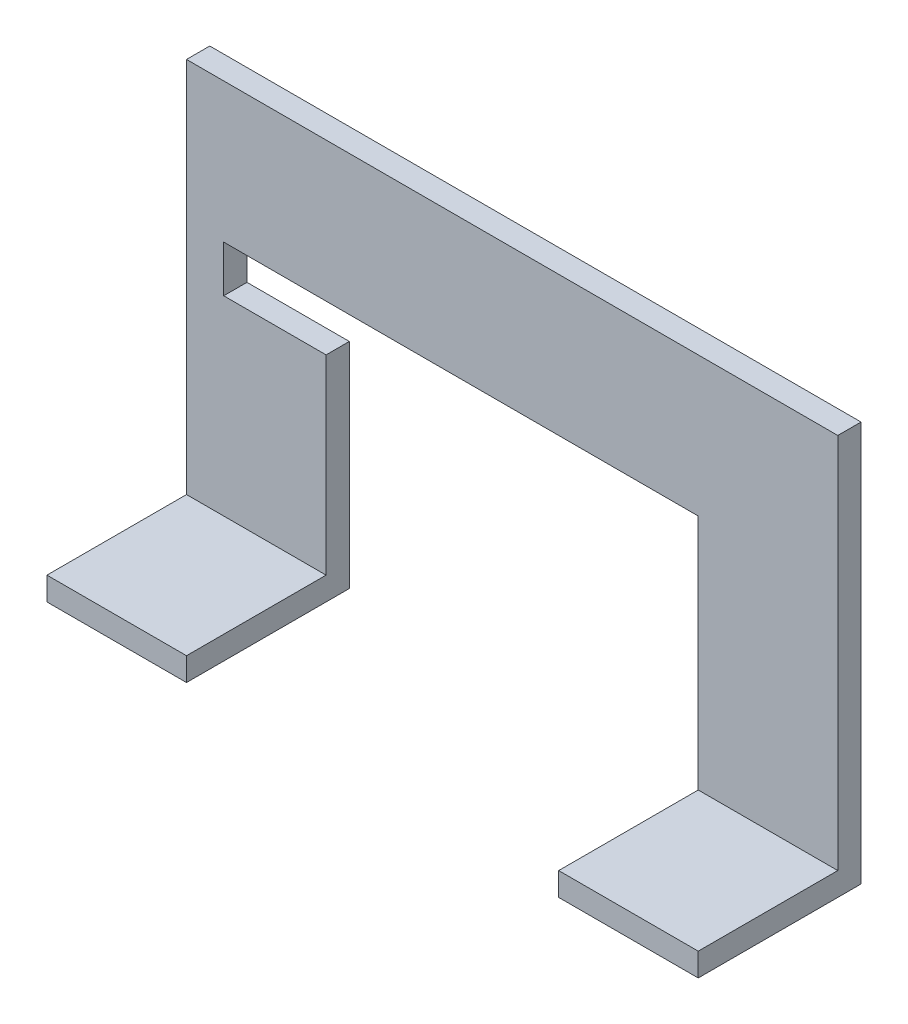
ISO-10303-21;
HEADER;
FILE_DESCRIPTION(('STEP AP214'),'2;1');
FILE_NAME('part.step','',(''),(''),'','','');
FILE_SCHEMA(('AUTOMOTIVE_DESIGN { 1 0 10303 214 1 1 1 1 }'));
ENDSEC;
DATA;
#1=APPLICATION_CONTEXT('core data for automotive mechanical design processes');
#2=APPLICATION_PROTOCOL_DEFINITION('international standard','automotive_design',2000,#1);
#3=PRODUCT_CONTEXT('',#1,'mechanical');
#4=PRODUCT('Part','Part','',(#3));
#5=PRODUCT_RELATED_PRODUCT_CATEGORY('part','',(#4));
#6=PRODUCT_DEFINITION_FORMATION('','',#4);
#7=PRODUCT_DEFINITION_CONTEXT('part definition',#1,'design');
#8=PRODUCT_DEFINITION('design','',#6,#7);
#9=PRODUCT_DEFINITION_SHAPE('','',#8);
#10=(LENGTH_UNIT() NAMED_UNIT(*) SI_UNIT(.MILLI.,.METRE.));
#11=(NAMED_UNIT(*) PLANE_ANGLE_UNIT() SI_UNIT($,.RADIAN.));
#12=(NAMED_UNIT(*) SI_UNIT($,.STERADIAN.) SOLID_ANGLE_UNIT());
#13=UNCERTAINTY_MEASURE_WITH_UNIT(LENGTH_MEASURE(1.E-05),#10,'distance_accuracy_value','');
#14=(GEOMETRIC_REPRESENTATION_CONTEXT(3) GLOBAL_UNCERTAINTY_ASSIGNED_CONTEXT((#13)) GLOBAL_UNIT_ASSIGNED_CONTEXT((#10,
#11,#12)) REPRESENTATION_CONTEXT('',''));
#15=CARTESIAN_POINT('',(0.,0.,0.));
#16=DIRECTION('',(0.,0.,1.));
#17=DIRECTION('',(1.,0.,0.));
#18=AXIS2_PLACEMENT_3D('',#15,#16,#17);
#19=CARTESIAN_POINT('',(20.,-15.,-2.5));
#20=DIRECTION('',(0.,-1.,0.));
#21=DIRECTION('',(0.,0.,-1.));
#22=AXIS2_PLACEMENT_3D('',#19,#20,#21);
#23=PLANE('',#22);
#24=DIRECTION('',(1.,0.,0.));
#25=VECTOR('',#24,1.);
#26=CARTESIAN_POINT('',(20.,-15.,0.));
#27=LINE('',#26,#25);
#28=CARTESIAN_POINT('',(-31.,-15.,0.));
#29=VERTEX_POINT('',#28);
#30=CARTESIAN_POINT('',(20.,-15.,0.));
#31=VERTEX_POINT('',#30);
#32=EDGE_CURVE('E183',#29,#31,#27,.T.);
#33=ORIENTED_EDGE('',*,*,#32,.F.);
#34=DIRECTION('',(0.,0.,1.));
#35=VECTOR('',#34,1.);
#36=CARTESIAN_POINT('',(-31.,-15.,-2.5));
#37=LINE('',#36,#35);
#38=CARTESIAN_POINT('',(-31.,-15.,-2.5));
#39=VERTEX_POINT('',#38);
#40=EDGE_CURVE('E11',#39,#29,#37,.T.);
#41=ORIENTED_EDGE('',*,*,#40,.F.);
#42=DIRECTION('',(1.,0.,0.));
#43=VECTOR('',#42,1.);
#44=CARTESIAN_POINT('',(20.,-15.,-2.5));
#45=LINE('',#44,#43);
#46=CARTESIAN_POINT('',(20.,-15.,-2.5));
#47=VERTEX_POINT('',#46);
#48=EDGE_CURVE('E184',#39,#47,#45,.T.);
#49=ORIENTED_EDGE('',*,*,#48,.T.);
#50=DIRECTION('',(0.,0.,1.));
#51=VECTOR('',#50,1.);
#52=CARTESIAN_POINT('',(20.,-15.,-2.5));
#53=LINE('',#52,#51);
#54=EDGE_CURVE('E38',#47,#31,#53,.T.);
#55=ORIENTED_EDGE('',*,*,#54,.T.);
#56=EDGE_LOOP('',(#33,#41,#49,#55));
#57=FACE_BOUND('',#56,.T.);
#58=ADVANCED_FACE('F35',(#57),#23,.T.);
#59=CARTESIAN_POINT('',(-31.,-15.,-2.5));
#60=DIRECTION('',(1.,0.,0.));
#61=DIRECTION('',(0.,0.,-1.));
#62=AXIS2_PLACEMENT_3D('',#59,#60,#61);
#63=PLANE('',#62);
#64=DIRECTION('',(0.,1.,0.));
#65=VECTOR('',#64,1.);
#66=CARTESIAN_POINT('',(-31.,-15.,0.));
#67=LINE('',#66,#65);
#68=CARTESIAN_POINT('',(-31.,-20.,0.));
#69=VERTEX_POINT('',#68);
#70=EDGE_CURVE('E188',#69,#29,#67,.T.);
#71=ORIENTED_EDGE('',*,*,#70,.F.);
#72=DIRECTION('',(0.,0.,1.));
#73=VECTOR('',#72,1.);
#74=CARTESIAN_POINT('',(-31.,-20.,-2.5));
#75=LINE('',#74,#73);
#76=CARTESIAN_POINT('',(-31.,-20.,-2.5));
#77=VERTEX_POINT('',#76);
#78=EDGE_CURVE('E43',#77,#69,#75,.T.);
#79=ORIENTED_EDGE('',*,*,#78,.F.);
#80=DIRECTION('',(0.,1.,0.));
#81=VECTOR('',#80,1.);
#82=CARTESIAN_POINT('',(-31.,-15.,-2.5));
#83=LINE('',#82,#81);
#84=EDGE_CURVE('E212',#77,#39,#83,.T.);
#85=ORIENTED_EDGE('',*,*,#84,.T.);
#86=ORIENTED_EDGE('',*,*,#40,.T.);
#87=EDGE_LOOP('',(#71,#79,#85,#86));
#88=FACE_BOUND('',#87,.T.);
#89=ADVANCED_FACE('F254',(#88),#63,.T.);
#90=CARTESIAN_POINT('',(-31.,-20.,-2.5));
#91=DIRECTION('',(0.,1.,0.));
#92=DIRECTION('',(-1.,0.,0.));
#93=AXIS2_PLACEMENT_3D('',#90,#91,#92);
#94=PLANE('',#93);
#95=DIRECTION('',(-1.,0.,0.));
#96=VECTOR('',#95,1.);
#97=CARTESIAN_POINT('',(-31.,-20.,0.));
#98=LINE('',#97,#96);
#99=CARTESIAN_POINT('',(-20.,-20.,0.));
#100=VERTEX_POINT('',#99);
#101=EDGE_CURVE('E225',#100,#69,#98,.T.);
#102=ORIENTED_EDGE('',*,*,#101,.F.);
#103=DIRECTION('',(0.,0.,1.));
#104=VECTOR('',#103,1.);
#105=CARTESIAN_POINT('',(-20.,-20.,-2.5));
#106=LINE('',#105,#104);
#107=CARTESIAN_POINT('',(-20.,-20.,-2.5));
#108=VERTEX_POINT('',#107);
#109=EDGE_CURVE('E231',#108,#100,#106,.T.);
#110=ORIENTED_EDGE('',*,*,#109,.F.);
#111=DIRECTION('',(-1.,0.,0.));
#112=VECTOR('',#111,1.);
#113=CARTESIAN_POINT('',(-31.,-20.,-2.5));
#114=LINE('',#113,#112);
#115=EDGE_CURVE('E209',#108,#77,#114,.T.);
#116=ORIENTED_EDGE('',*,*,#115,.T.);
#117=ORIENTED_EDGE('',*,*,#78,.T.);
#118=EDGE_LOOP('',(#102,#110,#116,#117));
#119=FACE_BOUND('',#118,.T.);
#120=ADVANCED_FACE('F285',(#119),#94,.T.);
#121=CARTESIAN_POINT('',(-20.,-20.,-2.5));
#122=DIRECTION('',(1.,0.,0.));
#123=DIRECTION('',(0.,0.,-1.));
#124=AXIS2_PLACEMENT_3D('',#121,#122,#123);
#125=PLANE('',#124);
#126=DIRECTION('',(0.,1.,0.));
#127=VECTOR('',#126,1.);
#128=CARTESIAN_POINT('',(-20.,-20.,0.));
#129=LINE('',#128,#127);
#130=CARTESIAN_POINT('',(-20.,-40.5,0.));
#131=VERTEX_POINT('',#130);
#132=EDGE_CURVE('E223',#131,#100,#129,.T.);
#133=ORIENTED_EDGE('',*,*,#132,.F.);
#134=DIRECTION('',(0.,0.,-1.));
#135=VECTOR('',#134,1.);
#136=CARTESIAN_POINT('',(-20.,-40.5,15.));
#137=LINE('',#136,#135);
#138=CARTESIAN_POINT('',(-20.,-40.5,15.));
#139=VERTEX_POINT('',#138);
#140=EDGE_CURVE('E180',#139,#131,#137,.T.);
#141=ORIENTED_EDGE('',*,*,#140,.F.);
#142=DIRECTION('',(0.,1.,0.));
#143=VECTOR('',#142,1.);
#144=CARTESIAN_POINT('',(-20.,-40.5,15.));
#145=LINE('',#144,#143);
#146=CARTESIAN_POINT('',(-20.,-43.,15.));
#147=VERTEX_POINT('',#146);
#148=EDGE_CURVE('E171',#147,#139,#145,.T.);
#149=ORIENTED_EDGE('',*,*,#148,.F.);
#150=DIRECTION('',(0.,0.,1.));
#151=VECTOR('',#150,1.);
#152=CARTESIAN_POINT('',(-20.,-43.,-2.5));
#153=LINE('',#152,#151);
#154=CARTESIAN_POINT('',(-20.,-43.,-2.5));
#155=VERTEX_POINT('',#154);
#156=EDGE_CURVE('E234',#155,#147,#153,.T.);
#157=ORIENTED_EDGE('',*,*,#156,.F.);
#158=DIRECTION('',(0.,1.,0.));
#159=VECTOR('',#158,1.);
#160=CARTESIAN_POINT('',(-20.,-20.,-2.5));
#161=LINE('',#160,#159);
#162=EDGE_CURVE('E206',#155,#108,#161,.T.);
#163=ORIENTED_EDGE('',*,*,#162,.T.);
#164=ORIENTED_EDGE('',*,*,#109,.T.);
#165=EDGE_LOOP('',(#133,#141,#149,#157,#163,#164));
#166=FACE_BOUND('',#165,.T.);
#167=ADVANCED_FACE('F282',(#166),#125,.T.);
#168=CARTESIAN_POINT('',(-20.,-43.,-2.5));
#169=DIRECTION('',(0.,-1.,0.));
#170=DIRECTION('',(0.,0.,-1.));
#171=AXIS2_PLACEMENT_3D('',#168,#169,#170);
#172=PLANE('',#171);
#173=ORIENTED_EDGE('',*,*,#156,.T.);
#174=DIRECTION('',(1.,0.,0.));
#175=VECTOR('',#174,1.);
#176=CARTESIAN_POINT('',(-35.,-43.,15.));
#177=LINE('',#176,#175);
#178=CARTESIAN_POINT('',(-35.,-43.,15.));
#179=VERTEX_POINT('',#178);
#180=EDGE_CURVE('E168',#179,#147,#177,.T.);
#181=ORIENTED_EDGE('',*,*,#180,.F.);
#182=DIRECTION('',(0.,0.,1.));
#183=VECTOR('',#182,1.);
#184=CARTESIAN_POINT('',(-35.,-43.,-2.5));
#185=LINE('',#184,#183);
#186=CARTESIAN_POINT('',(-35.,-43.,-2.5));
#187=VERTEX_POINT('',#186);
#188=EDGE_CURVE('E236',#187,#179,#185,.T.);
#189=ORIENTED_EDGE('',*,*,#188,.F.);
#190=DIRECTION('',(1.,0.,0.));
#191=VECTOR('',#190,1.);
#192=CARTESIAN_POINT('',(-20.,-43.,-2.5));
#193=LINE('',#192,#191);
#194=EDGE_CURVE('E203',#187,#155,#193,.T.);
#195=ORIENTED_EDGE('',*,*,#194,.T.);
#196=EDGE_LOOP('',(#173,#181,#189,#195));
#197=FACE_BOUND('',#196,.T.);
#198=ADVANCED_FACE('F289',(#197),#172,.T.);
#199=CARTESIAN_POINT('',(-35.,-43.,-2.5));
#200=DIRECTION('',(-1.,0.,0.));
#201=DIRECTION('',(0.,0.,1.));
#202=AXIS2_PLACEMENT_3D('',#199,#200,#201);
#203=PLANE('',#202);
#204=DIRECTION('',(0.,-1.,0.));
#205=VECTOR('',#204,1.);
#206=CARTESIAN_POINT('',(-35.,-43.,0.));
#207=LINE('',#206,#205);
#208=CARTESIAN_POINT('',(-35.,0.,0.));
#209=VERTEX_POINT('',#208);
#210=CARTESIAN_POINT('',(-35.,-40.5,0.));
#211=VERTEX_POINT('',#210);
#212=EDGE_CURVE('E221',#209,#211,#207,.T.);
#213=ORIENTED_EDGE('',*,*,#212,.F.);
#214=DIRECTION('',(0.,0.,1.));
#215=VECTOR('',#214,1.);
#216=CARTESIAN_POINT('',(-35.,0.,-2.5));
#217=LINE('',#216,#215);
#218=CARTESIAN_POINT('',(-35.,0.,-2.5));
#219=VERTEX_POINT('',#218);
#220=EDGE_CURVE('E238',#219,#209,#217,.T.);
#221=ORIENTED_EDGE('',*,*,#220,.F.);
#222=DIRECTION('',(0.,-1.,0.));
#223=VECTOR('',#222,1.);
#224=CARTESIAN_POINT('',(-35.,-43.,-2.5));
#225=LINE('',#224,#223);
#226=EDGE_CURVE('E200',#219,#187,#225,.T.);
#227=ORIENTED_EDGE('',*,*,#226,.T.);
#228=ORIENTED_EDGE('',*,*,#188,.T.);
#229=DIRECTION('',(0.,-1.,0.));
#230=VECTOR('',#229,1.);
#231=CARTESIAN_POINT('',(-35.,-40.5,15.));
#232=LINE('',#231,#230);
#233=CARTESIAN_POINT('',(-35.,-40.5,15.));
#234=VERTEX_POINT('',#233);
#235=EDGE_CURVE('E165',#234,#179,#232,.T.);
#236=ORIENTED_EDGE('',*,*,#235,.F.);
#237=DIRECTION('',(0.,0.,-1.));
#238=VECTOR('',#237,1.);
#239=CARTESIAN_POINT('',(-35.,-40.5,15.));
#240=LINE('',#239,#238);
#241=EDGE_CURVE('E175',#234,#211,#240,.T.);
#242=ORIENTED_EDGE('',*,*,#241,.T.);
#243=EDGE_LOOP('',(#213,#221,#227,#228,#236,#242));
#244=FACE_BOUND('',#243,.T.);
#245=ADVANCED_FACE('F276',(#244),#203,.T.);
#246=CARTESIAN_POINT('',(-35.,0.,-2.5));
#247=DIRECTION('',(0.,1.,0.));
#248=DIRECTION('',(0.,0.,1.));
#249=AXIS2_PLACEMENT_3D('',#246,#247,#248);
#250=PLANE('',#249);
#251=DIRECTION('',(-1.,0.,0.));
#252=VECTOR('',#251,1.);
#253=CARTESIAN_POINT('',(-35.,0.,0.));
#254=LINE('',#253,#252);
#255=CARTESIAN_POINT('',(35.,0.,0.));
#256=VERTEX_POINT('',#255);
#257=EDGE_CURVE('E218',#256,#209,#254,.T.);
#258=ORIENTED_EDGE('',*,*,#257,.F.);
#259=DIRECTION('',(0.,0.,1.));
#260=VECTOR('',#259,1.);
#261=CARTESIAN_POINT('',(35.,0.,-2.5));
#262=LINE('',#261,#260);
#263=CARTESIAN_POINT('',(35.,0.,-2.5));
#264=VERTEX_POINT('',#263);
#265=EDGE_CURVE('E240',#264,#256,#262,.T.);
#266=ORIENTED_EDGE('',*,*,#265,.F.);
#267=DIRECTION('',(-1.,0.,0.));
#268=VECTOR('',#267,1.);
#269=CARTESIAN_POINT('',(-35.,0.,-2.5));
#270=LINE('',#269,#268);
#271=EDGE_CURVE('E197',#264,#219,#270,.T.);
#272=ORIENTED_EDGE('',*,*,#271,.T.);
#273=ORIENTED_EDGE('',*,*,#220,.T.);
#274=EDGE_LOOP('',(#258,#266,#272,#273));
#275=FACE_BOUND('',#274,.T.);
#276=ADVANCED_FACE('F266',(#275),#250,.T.);
#277=CARTESIAN_POINT('',(35.,0.,-2.5));
#278=DIRECTION('',(1.,0.,0.));
#279=DIRECTION('',(0.,1.,0.));
#280=AXIS2_PLACEMENT_3D('',#277,#278,#279);
#281=PLANE('',#280);
#282=DIRECTION('',(0.,1.,0.));
#283=VECTOR('',#282,1.);
#284=CARTESIAN_POINT('',(35.,0.,0.));
#285=LINE('',#284,#283);
#286=CARTESIAN_POINT('',(35.,-40.5,0.));
#287=VERTEX_POINT('',#286);
#288=EDGE_CURVE('E142',#287,#256,#285,.T.);
#289=ORIENTED_EDGE('',*,*,#288,.F.);
#290=DIRECTION('',(0.,0.,-1.));
#291=VECTOR('',#290,1.);
#292=CARTESIAN_POINT('',(35.,-40.5,15.));
#293=LINE('',#292,#291);
#294=CARTESIAN_POINT('',(35.,-40.5,15.));
#295=VERTEX_POINT('',#294);
#296=EDGE_CURVE('E136',#295,#287,#293,.T.);
#297=ORIENTED_EDGE('',*,*,#296,.F.);
#298=DIRECTION('',(0.,-1.,0.));
#299=VECTOR('',#298,1.);
#300=CARTESIAN_POINT('',(35.,-40.5,15.));
#301=LINE('',#300,#299);
#302=CARTESIAN_POINT('',(35.,-43.,15.));
#303=VERTEX_POINT('',#302);
#304=EDGE_CURVE('E139',#295,#303,#301,.T.);
#305=ORIENTED_EDGE('',*,*,#304,.T.);
#306=DIRECTION('',(0.,0.,1.));
#307=VECTOR('',#306,1.);
#308=CARTESIAN_POINT('',(35.,-43.,-2.5));
#309=LINE('',#308,#307);
#310=CARTESIAN_POINT('',(35.,-43.,-2.5));
#311=VERTEX_POINT('',#310);
#312=EDGE_CURVE('E242',#311,#303,#309,.T.);
#313=ORIENTED_EDGE('',*,*,#312,.F.);
#314=DIRECTION('',(0.,1.,0.));
#315=VECTOR('',#314,1.);
#316=CARTESIAN_POINT('',(35.,0.,-2.5));
#317=LINE('',#316,#315);
#318=EDGE_CURVE('E194',#311,#264,#317,.T.);
#319=ORIENTED_EDGE('',*,*,#318,.T.);
#320=ORIENTED_EDGE('',*,*,#265,.T.);
#321=EDGE_LOOP('',(#289,#297,#305,#313,#319,#320));
#322=FACE_BOUND('',#321,.T.);
#323=ADVANCED_FACE('F138',(#322),#281,.T.);
#324=CARTESIAN_POINT('',(35.,-43.,-2.5));
#325=DIRECTION('',(0.,-1.,0.));
#326=DIRECTION('',(0.,0.,-1.));
#327=AXIS2_PLACEMENT_3D('',#324,#325,#326);
#328=PLANE('',#327);
#329=ORIENTED_EDGE('',*,*,#312,.T.);
#330=DIRECTION('',(-1.,0.,0.));
#331=VECTOR('',#330,1.);
#332=CARTESIAN_POINT('',(35.,-43.,15.));
#333=LINE('',#332,#331);
#334=CARTESIAN_POINT('',(20.,-43.,15.));
#335=VERTEX_POINT('',#334);
#336=EDGE_CURVE('E155',#303,#335,#333,.T.);
#337=ORIENTED_EDGE('',*,*,#336,.T.);
#338=DIRECTION('',(0.,0.,1.));
#339=VECTOR('',#338,1.);
#340=CARTESIAN_POINT('',(20.,-43.,-2.5));
#341=LINE('',#340,#339);
#342=CARTESIAN_POINT('',(20.,-43.,-2.5));
#343=VERTEX_POINT('',#342);
#344=EDGE_CURVE('E243',#343,#335,#341,.T.);
#345=ORIENTED_EDGE('',*,*,#344,.F.);
#346=DIRECTION('',(1.,0.,0.));
#347=VECTOR('',#346,1.);
#348=CARTESIAN_POINT('',(35.,-43.,-2.5));
#349=LINE('',#348,#347);
#350=EDGE_CURVE('E191',#343,#311,#349,.T.);
#351=ORIENTED_EDGE('',*,*,#350,.T.);
#352=EDGE_LOOP('',(#329,#337,#345,#351));
#353=FACE_BOUND('',#352,.T.);
#354=ADVANCED_FACE('F263',(#353),#328,.T.);
#355=CARTESIAN_POINT('',(20.,-43.,-2.5));
#356=DIRECTION('',(-1.,0.,0.));
#357=DIRECTION('',(0.,0.,1.));
#358=AXIS2_PLACEMENT_3D('',#355,#356,#357);
#359=PLANE('',#358);
#360=DIRECTION('',(0.,-1.,0.));
#361=VECTOR('',#360,1.);
#362=CARTESIAN_POINT('',(20.,-43.,0.));
#363=LINE('',#362,#361);
#364=CARTESIAN_POINT('',(20.,-40.5,0.));
#365=VERTEX_POINT('',#364);
#366=EDGE_CURVE('E56',#31,#365,#363,.T.);
#367=ORIENTED_EDGE('',*,*,#366,.F.);
#368=ORIENTED_EDGE('',*,*,#54,.F.);
#369=DIRECTION('',(0.,-1.,0.));
#370=VECTOR('',#369,1.);
#371=CARTESIAN_POINT('',(20.,-43.,-2.5));
#372=LINE('',#371,#370);
#373=EDGE_CURVE('E187',#47,#343,#372,.T.);
#374=ORIENTED_EDGE('',*,*,#373,.T.);
#375=ORIENTED_EDGE('',*,*,#344,.T.);
#376=DIRECTION('',(0.,1.,0.));
#377=VECTOR('',#376,1.);
#378=CARTESIAN_POINT('',(20.,-40.5,15.));
#379=LINE('',#378,#377);
#380=CARTESIAN_POINT('',(20.,-40.5,15.));
#381=VERTEX_POINT('',#380);
#382=EDGE_CURVE('E158',#335,#381,#379,.T.);
#383=ORIENTED_EDGE('',*,*,#382,.T.);
#384=DIRECTION('',(0.,0.,-1.));
#385=VECTOR('',#384,1.);
#386=CARTESIAN_POINT('',(20.,-40.5,15.));
#387=LINE('',#386,#385);
#388=EDGE_CURVE('E146',#381,#365,#387,.T.);
#389=ORIENTED_EDGE('',*,*,#388,.T.);
#390=EDGE_LOOP('',(#367,#368,#374,#375,#383,#389));
#391=FACE_BOUND('',#390,.T.);
#392=ADVANCED_FACE('F249',(#391),#359,.T.);
#393=CARTESIAN_POINT('',(0.,0.,-2.5));
#394=DIRECTION('',(0.,0.,1.));
#395=DIRECTION('',(1.,0.,0.));
#396=AXIS2_PLACEMENT_3D('',#393,#394,#395);
#397=PLANE('',#396);
#398=ORIENTED_EDGE('',*,*,#48,.F.);
#399=ORIENTED_EDGE('',*,*,#84,.F.);
#400=ORIENTED_EDGE('',*,*,#115,.F.);
#401=ORIENTED_EDGE('',*,*,#162,.F.);
#402=ORIENTED_EDGE('',*,*,#194,.F.);
#403=ORIENTED_EDGE('',*,*,#226,.F.);
#404=ORIENTED_EDGE('',*,*,#271,.F.);
#405=ORIENTED_EDGE('',*,*,#318,.F.);
#406=ORIENTED_EDGE('',*,*,#350,.F.);
#407=ORIENTED_EDGE('',*,*,#373,.F.);
#408=EDGE_LOOP('',(#398,#399,#400,#401,#402,#403,#404,#405,#406,#407));
#409=FACE_BOUND('',#408,.T.);
#410=ADVANCED_FACE('F257',(#409),#397,.F.);
#411=CARTESIAN_POINT('',(0.,0.,0.));
#412=DIRECTION('',(0.,0.,1.));
#413=DIRECTION('',(1.,0.,0.));
#414=AXIS2_PLACEMENT_3D('',#411,#412,#413);
#415=PLANE('',#414);
#416=DIRECTION('',(1.,0.,0.));
#417=VECTOR('',#416,1.);
#418=CARTESIAN_POINT('',(35.,-40.5,0.));
#419=LINE('',#418,#417);
#420=EDGE_CURVE('E51',#365,#287,#419,.T.);
#421=ORIENTED_EDGE('',*,*,#420,.T.);
#422=ORIENTED_EDGE('',*,*,#288,.T.);
#423=ORIENTED_EDGE('',*,*,#257,.T.);
#424=ORIENTED_EDGE('',*,*,#212,.T.);
#425=DIRECTION('',(-1.,0.,0.));
#426=VECTOR('',#425,1.);
#427=CARTESIAN_POINT('',(-35.,-40.5,0.));
#428=LINE('',#427,#426);
#429=EDGE_CURVE('E145',#131,#211,#428,.T.);
#430=ORIENTED_EDGE('',*,*,#429,.F.);
#431=ORIENTED_EDGE('',*,*,#132,.T.);
#432=ORIENTED_EDGE('',*,*,#101,.T.);
#433=ORIENTED_EDGE('',*,*,#70,.T.);
#434=ORIENTED_EDGE('',*,*,#32,.T.);
#435=ORIENTED_EDGE('',*,*,#366,.T.);
#436=EDGE_LOOP('',(#421,#422,#423,#424,#430,#431,#432,#433,#434,#435));
#437=FACE_BOUND('',#436,.T.);
#438=ADVANCED_FACE('F250',(#437),#415,.T.);
#439=CARTESIAN_POINT('',(-35.,-40.5,15.));
#440=DIRECTION('',(0.,-1.,0.));
#441=DIRECTION('',(0.,0.,-1.));
#442=AXIS2_PLACEMENT_3D('',#439,#440,#441);
#443=PLANE('',#442);
#444=ORIENTED_EDGE('',*,*,#429,.T.);
#445=ORIENTED_EDGE('',*,*,#241,.F.);
#446=DIRECTION('',(-1.,0.,0.));
#447=VECTOR('',#446,1.);
#448=CARTESIAN_POINT('',(-35.,-40.5,15.));
#449=LINE('',#448,#447);
#450=EDGE_CURVE('E173',#139,#234,#449,.T.);
#451=ORIENTED_EDGE('',*,*,#450,.F.);
#452=ORIENTED_EDGE('',*,*,#140,.T.);
#453=EDGE_LOOP('',(#444,#445,#451,#452));
#454=FACE_BOUND('',#453,.T.);
#455=ADVANCED_FACE('F272',(#454),#443,.F.);
#456=CARTESIAN_POINT('',(0.,0.,15.));
#457=DIRECTION('',(0.,0.,1.));
#458=DIRECTION('',(1.,0.,0.));
#459=AXIS2_PLACEMENT_3D('',#456,#457,#458);
#460=PLANE('',#459);
#461=ORIENTED_EDGE('',*,*,#235,.T.);
#462=ORIENTED_EDGE('',*,*,#180,.T.);
#463=ORIENTED_EDGE('',*,*,#148,.T.);
#464=ORIENTED_EDGE('',*,*,#450,.T.);
#465=EDGE_LOOP('',(#461,#462,#463,#464));
#466=FACE_BOUND('',#465,.T.);
#467=ADVANCED_FACE('F279',(#466),#460,.T.);
#468=CARTESIAN_POINT('',(35.,-40.5,15.));
#469=DIRECTION('',(0.,1.,0.));
#470=DIRECTION('',(0.,0.,1.));
#471=AXIS2_PLACEMENT_3D('',#468,#469,#470);
#472=PLANE('',#471);
#473=ORIENTED_EDGE('',*,*,#420,.F.);
#474=ORIENTED_EDGE('',*,*,#388,.F.);
#475=DIRECTION('',(1.,0.,0.));
#476=VECTOR('',#475,1.);
#477=CARTESIAN_POINT('',(35.,-40.5,15.));
#478=LINE('',#477,#476);
#479=EDGE_CURVE('E152',#381,#295,#478,.T.);
#480=ORIENTED_EDGE('',*,*,#479,.T.);
#481=ORIENTED_EDGE('',*,*,#296,.T.);
#482=EDGE_LOOP('',(#473,#474,#480,#481));
#483=FACE_BOUND('',#482,.T.);
#484=ADVANCED_FACE('F157',(#483),#472,.T.);
#485=CARTESIAN_POINT('',(0.,0.,15.));
#486=DIRECTION('',(0.,0.,1.));
#487=DIRECTION('',(-1.,0.,0.));
#488=AXIS2_PLACEMENT_3D('',#485,#486,#487);
#489=PLANE('',#488);
#490=ORIENTED_EDGE('',*,*,#304,.F.);
#491=ORIENTED_EDGE('',*,*,#479,.F.);
#492=ORIENTED_EDGE('',*,*,#382,.F.);
#493=ORIENTED_EDGE('',*,*,#336,.F.);
#494=EDGE_LOOP('',(#490,#491,#492,#493));
#495=FACE_BOUND('',#494,.T.);
#496=ADVANCED_FACE('F150',(#495),#489,.T.);
#497=CLOSED_SHELL('',(#58,#89,#120,#167,#198,#245,#276,#323,#354,#392,#410,#438,#455,#467,#484,#496));
#498=MANIFOLD_SOLID_BREP('B2',#497);
#499=ADVANCED_BREP_SHAPE_REPRESENTATION('',(#18,#498),#14);
#500=SHAPE_DEFINITION_REPRESENTATION(#9,#499);
ENDSEC;
END-ISO-10303-21;
